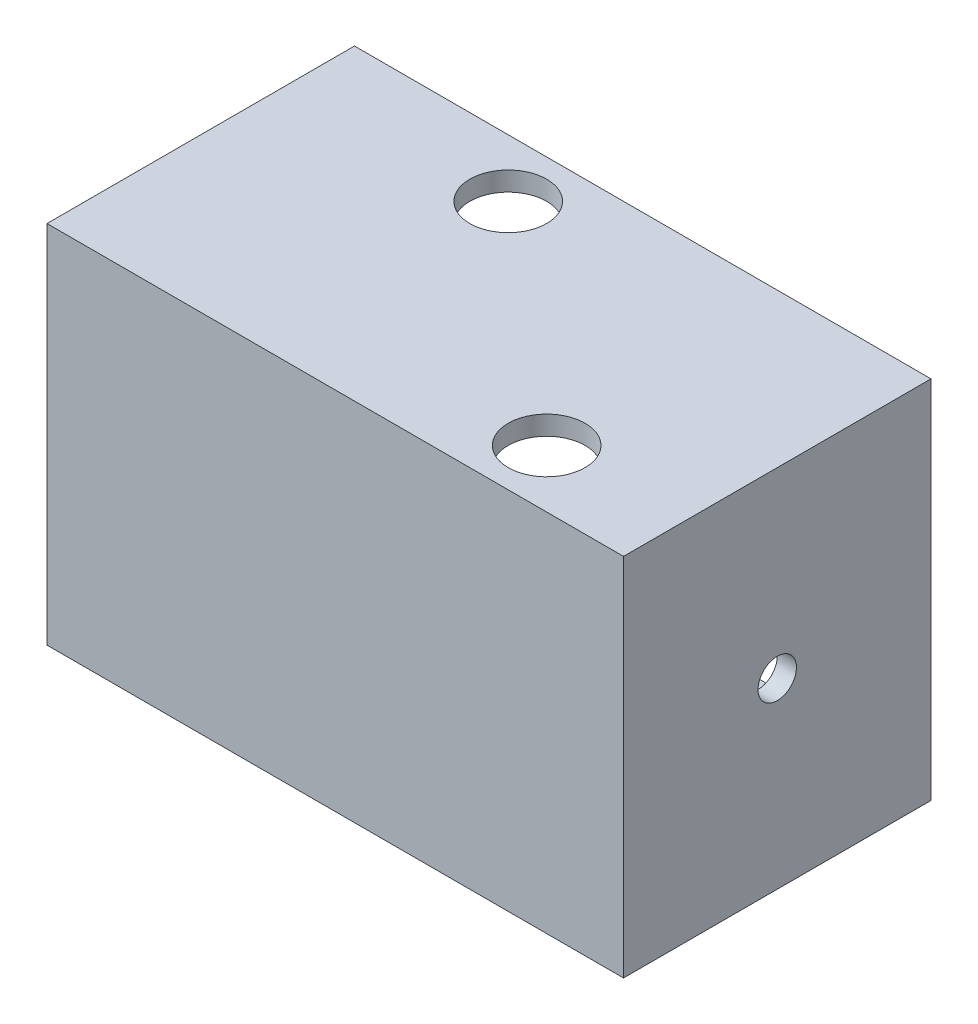
ISO-10303-21;
HEADER;
FILE_DESCRIPTION(('STEP AP214'),'2;1');
FILE_NAME('part.step','',(''),(''),'','','');
FILE_SCHEMA(('AUTOMOTIVE_DESIGN { 1 0 10303 214 1 1 1 1 }'));
ENDSEC;
DATA;
#1=APPLICATION_CONTEXT('core data for automotive mechanical design processes');
#2=APPLICATION_PROTOCOL_DEFINITION('international standard','automotive_design',2000,#1);
#3=PRODUCT_CONTEXT('',#1,'mechanical');
#4=PRODUCT('Part','Part','',(#3));
#5=PRODUCT_RELATED_PRODUCT_CATEGORY('part','',(#4));
#6=PRODUCT_DEFINITION_FORMATION('','',#4);
#7=PRODUCT_DEFINITION_CONTEXT('part definition',#1,'design');
#8=PRODUCT_DEFINITION('design','',#6,#7);
#9=PRODUCT_DEFINITION_SHAPE('','',#8);
#10=(LENGTH_UNIT() NAMED_UNIT(*) SI_UNIT(.MILLI.,.METRE.));
#11=(NAMED_UNIT(*) PLANE_ANGLE_UNIT() SI_UNIT($,.RADIAN.));
#12=(NAMED_UNIT(*) SI_UNIT($,.STERADIAN.) SOLID_ANGLE_UNIT());
#13=UNCERTAINTY_MEASURE_WITH_UNIT(LENGTH_MEASURE(1.E-05),#10,'distance_accuracy_value','');
#14=(GEOMETRIC_REPRESENTATION_CONTEXT(3) GLOBAL_UNCERTAINTY_ASSIGNED_CONTEXT((#13)) GLOBAL_UNIT_ASSIGNED_CONTEXT((#10,
#11,#12)) REPRESENTATION_CONTEXT('',''));
#15=CARTESIAN_POINT('',(0.,0.,0.));
#16=DIRECTION('',(0.,0.,1.));
#17=DIRECTION('',(1.,0.,0.));
#18=AXIS2_PLACEMENT_3D('',#15,#16,#17);
#19=CARTESIAN_POINT('',(29.,9.5,8.));
#20=DIRECTION('',(-1.,0.,0.));
#21=DIRECTION('',(0.,0.,1.));
#22=AXIS2_PLACEMENT_3D('',#19,#20,#21);
#23=CYLINDRICAL_SURFACE('',#22,3.);
#24=CARTESIAN_POINT('',(0.,9.5,8.));
#25=DIRECTION('',(-1.,0.,0.));
#26=DIRECTION('',(0.,0.,1.));
#27=AXIS2_PLACEMENT_3D('',#24,#25,#26);
#28=CIRCLE('',#27,3.);
#29=CARTESIAN_POINT('',(0.,9.5,11.));
#30=VERTEX_POINT('',#29);
#31=EDGE_CURVE('E175',#30,#30,#28,.T.);
#32=CARTESIAN_POINT('',(0.999999999999997,9.5,8.));
#33=DIRECTION('',(1.,0.,0.));
#34=DIRECTION('',(0.,1.,0.));
#35=AXIS2_PLACEMENT_3D('',#32,#33,#34);
#36=CIRCLE('',#35,3.);
#37=CARTESIAN_POINT('',(0.999999999999994,9.5,11.));
#38=VERTEX_POINT('',#37);
#39=EDGE_CURVE('E164',#38,#38,#36,.F.);
#40=CARTESIAN_POINT('',(0.,9.5,11.));
#41=CARTESIAN_POINT('',(0.0104166666666667,9.5,11.));
#42=CARTESIAN_POINT('',(0.0208333333333333,9.5,11.));
#43=CARTESIAN_POINT('',(0.0416666666666667,9.5,11.));
#44=CARTESIAN_POINT('',(0.0520833333333334,9.5,11.));
#45=CARTESIAN_POINT('',(0.0729166666666667,9.5,11.));
#46=CARTESIAN_POINT('',(0.0833333333333334,9.5,11.));
#47=CARTESIAN_POINT('',(0.104166666666667,9.5,11.));
#48=CARTESIAN_POINT('',(0.114583333333333,9.5,11.));
#49=CARTESIAN_POINT('',(0.135416666666667,9.5,11.));
#50=CARTESIAN_POINT('',(0.145833333333333,9.5,11.));
#51=CARTESIAN_POINT('',(0.166666666666667,9.5,11.));
#52=CARTESIAN_POINT('',(0.177083333333333,9.5,11.));
#53=CARTESIAN_POINT('',(0.197916666666667,9.5,11.));
#54=CARTESIAN_POINT('',(0.208333333333334,9.5,11.));
#55=CARTESIAN_POINT('',(0.229166666666667,9.5,11.));
#56=CARTESIAN_POINT('',(0.239583333333334,9.5,11.));
#57=CARTESIAN_POINT('',(0.260416666666666,9.5,11.));
#58=CARTESIAN_POINT('',(0.270833333333331,9.5,11.));
#59=CARTESIAN_POINT('',(0.291666666666663,9.5,11.));
#60=CARTESIAN_POINT('',(0.30208333333333,9.5,11.));
#61=CARTESIAN_POINT('',(0.322916666666663,9.5,11.));
#62=CARTESIAN_POINT('',(0.33333333333333,9.5,11.));
#63=CARTESIAN_POINT('',(0.354166666666664,9.5,11.));
#64=CARTESIAN_POINT('',(0.36458333333333,9.5,11.));
#65=CARTESIAN_POINT('',(0.385416666666664,9.5,11.));
#66=CARTESIAN_POINT('',(0.39583333333333,9.5,11.));
#67=CARTESIAN_POINT('',(0.416666666666664,9.5,11.));
#68=CARTESIAN_POINT('',(0.42708333333333,9.5,11.));
#69=CARTESIAN_POINT('',(0.447916666666664,9.5,11.));
#70=CARTESIAN_POINT('',(0.45833333333333,9.5,11.));
#71=CARTESIAN_POINT('',(0.479166666666664,9.5,11.));
#72=CARTESIAN_POINT('',(0.48958333333333,9.5,11.));
#73=CARTESIAN_POINT('',(0.510416666666664,9.5,11.));
#74=CARTESIAN_POINT('',(0.52083333333333,9.5,11.));
#75=CARTESIAN_POINT('',(0.541666666666664,9.5,11.));
#76=CARTESIAN_POINT('',(0.55208333333333,9.5,11.));
#77=CARTESIAN_POINT('',(0.572916666666664,9.5,11.));
#78=CARTESIAN_POINT('',(0.58333333333333,9.5,11.));
#79=CARTESIAN_POINT('',(0.604166666666664,9.5,11.));
#80=CARTESIAN_POINT('',(0.61458333333333,9.5,11.));
#81=CARTESIAN_POINT('',(0.635416666666664,9.5,11.));
#82=CARTESIAN_POINT('',(0.64583333333333,9.5,11.));
#83=CARTESIAN_POINT('',(0.666666666666664,9.5,11.));
#84=CARTESIAN_POINT('',(0.67708333333333,9.5,11.));
#85=CARTESIAN_POINT('',(0.697916666666664,9.5,11.));
#86=CARTESIAN_POINT('',(0.70833333333333,9.5,11.));
#87=CARTESIAN_POINT('',(0.729166666666663,9.5,11.));
#88=CARTESIAN_POINT('',(0.739583333333328,9.5,11.));
#89=CARTESIAN_POINT('',(0.76041666666666,9.5,11.));
#90=CARTESIAN_POINT('',(0.770833333333327,9.5,11.));
#91=CARTESIAN_POINT('',(0.79166666666666,9.5,11.));
#92=CARTESIAN_POINT('',(0.802083333333327,9.5,11.));
#93=CARTESIAN_POINT('',(0.822916666666661,9.5,11.));
#94=CARTESIAN_POINT('',(0.833333333333327,9.5,11.));
#95=CARTESIAN_POINT('',(0.854166666666661,9.5,11.));
#96=CARTESIAN_POINT('',(0.864583333333327,9.5,11.));
#97=CARTESIAN_POINT('',(0.885416666666661,9.5,11.));
#98=CARTESIAN_POINT('',(0.895833333333327,9.5,11.));
#99=CARTESIAN_POINT('',(0.916666666666661,9.5,11.));
#100=CARTESIAN_POINT('',(0.927083333333327,9.5,11.));
#101=CARTESIAN_POINT('',(0.947916666666661,9.5,11.));
#102=CARTESIAN_POINT('',(0.958333333333327,9.5,11.));
#103=CARTESIAN_POINT('',(0.979166666666661,9.5,11.));
#104=CARTESIAN_POINT('',(0.989583333333327,9.5,11.));
#105=CARTESIAN_POINT('',(0.999999999999994,9.5,11.));
#106=B_SPLINE_CURVE_WITH_KNOTS('',3,(#40,#41,#42,#43,#44,#45,#46,#47,#48,#49,#50,#51,#52,#53,
#54,#55,#56,#57,#58,#59,#60,#61,#62,#63,#64,#65,#66,#67,#68,#69,#70,#71,#72,#73,#74,#75,#76,#77,
#78,#79,#80,#81,#82,#83,#84,#85,#86,#87,#88,#89,#90,#91,#92,#93,#94,#95,#96,#97,#98,#99,#100,
#101,#102,#103,#104,#105),.UNSPECIFIED.,.F.,.F.,(4,2,2,2,2,2,2,2,2,2,2,2,2,2,2,2,2,2,2,2,2,2,2,
2,2,2,2,2,2,2,2,2,4),(0.,0.03125,0.0625000000000001,0.0937500000000001,0.125,0.15625,0.1875,
0.21875,0.25,0.281249999999997,0.312499999999997,0.343749999999997,0.374999999999997,
0.406249999999997,0.437499999999997,0.468749999999997,0.499999999999997,0.531249999999997,
0.562499999999997,0.593749999999997,0.624999999999997,0.656249999999997,0.687499999999997,
0.718749999999997,0.749999999999994,0.781249999999994,0.812499999999994,0.843749999999994,
0.874999999999994,0.906249999999994,0.937499999999994,0.968749999999994,0.999999999999994),.UNSPECIFIED.);
#107=EDGE_CURVE('BSEAM43',#30,#38,#106,.T.);
#108=ORIENTED_EDGE('',*,*,#31,.T.);
#109=ORIENTED_EDGE('',*,*,#39,.F.);
#110=ORIENTED_EDGE('',*,*,#107,.T.);
#111=ORIENTED_EDGE('',*,*,#107,.F.);
#112=EDGE_LOOP('',(#108,#110,#109,#111));
#113=FACE_BOUND('',#112,.T.);
#114=ADVANCED_FACE('F43',(#113),#23,.F.);
#115=CARTESIAN_POINT('',(0.,0.,16.));
#116=DIRECTION('',(1.,0.,0.));
#117=DIRECTION('',(0.,0.,-1.));
#118=AXIS2_PLACEMENT_3D('',#115,#116,#117);
#119=PLANE('',#118);
#120=ORIENTED_EDGE('',*,*,#31,.F.);
#121=EDGE_LOOP('',(#120));
#122=FACE_BOUND('',#121,.T.);
#123=DIRECTION('',(0.,-1.,0.));
#124=VECTOR('',#123,1.);
#125=CARTESIAN_POINT('',(0.,0.,0.));
#126=LINE('',#125,#124);
#127=CARTESIAN_POINT('',(0.,19.,0.));
#128=VERTEX_POINT('',#127);
#129=CARTESIAN_POINT('',(0.,0.,0.));
#130=VERTEX_POINT('',#129);
#131=EDGE_CURVE('E179',#128,#130,#126,.T.);
#132=ORIENTED_EDGE('',*,*,#131,.T.);
#133=DIRECTION('',(0.,0.,-1.));
#134=VECTOR('',#133,1.);
#135=CARTESIAN_POINT('',(0.,0.,16.));
#136=LINE('',#135,#134);
#137=CARTESIAN_POINT('',(0.,0.,16.));
#138=VERTEX_POINT('',#137);
#139=EDGE_CURVE('E11',#138,#130,#136,.T.);
#140=ORIENTED_EDGE('',*,*,#139,.F.);
#141=DIRECTION('',(0.,-1.,0.));
#142=VECTOR('',#141,1.);
#143=CARTESIAN_POINT('',(0.,0.,16.));
#144=LINE('',#143,#142);
#145=CARTESIAN_POINT('',(0.,19.,16.));
#146=VERTEX_POINT('',#145);
#147=EDGE_CURVE('E180',#146,#138,#144,.T.);
#148=ORIENTED_EDGE('',*,*,#147,.F.);
#149=DIRECTION('',(0.,0.,-1.));
#150=VECTOR('',#149,1.);
#151=CARTESIAN_POINT('',(0.,19.,16.));
#152=LINE('',#151,#150);
#153=EDGE_CURVE('E194',#146,#128,#152,.T.);
#154=ORIENTED_EDGE('',*,*,#153,.T.);
#155=EDGE_LOOP('',(#132,#140,#148,#154));
#156=FACE_BOUND('',#155,.T.);
#157=ADVANCED_FACE('F45',(#122,#156),#119,.F.);
#158=CARTESIAN_POINT('',(0.,0.,16.));
#159=DIRECTION('',(0.,1.,0.));
#160=DIRECTION('',(0.,0.,1.));
#161=AXIS2_PLACEMENT_3D('',#158,#159,#160);
#162=PLANE('',#161);
#163=DIRECTION('',(1.,0.,0.));
#164=VECTOR('',#163,1.);
#165=CARTESIAN_POINT('',(0.,0.,0.));
#166=LINE('',#165,#164);
#167=CARTESIAN_POINT('',(30.,0.,0.));
#168=VERTEX_POINT('',#167);
#169=EDGE_CURVE('E198',#130,#168,#166,.T.);
#170=ORIENTED_EDGE('',*,*,#169,.T.);
#171=DIRECTION('',(0.,0.,-1.));
#172=VECTOR('',#171,1.);
#173=CARTESIAN_POINT('',(30.,0.,16.));
#174=LINE('',#173,#172);
#175=CARTESIAN_POINT('',(30.,0.,16.));
#176=VERTEX_POINT('',#175);
#177=EDGE_CURVE('E53',#176,#168,#174,.T.);
#178=ORIENTED_EDGE('',*,*,#177,.F.);
#179=DIRECTION('',(1.,0.,0.));
#180=VECTOR('',#179,1.);
#181=CARTESIAN_POINT('',(0.,0.,16.));
#182=LINE('',#181,#180);
#183=EDGE_CURVE('E184',#138,#176,#182,.T.);
#184=ORIENTED_EDGE('',*,*,#183,.F.);
#185=ORIENTED_EDGE('',*,*,#139,.T.);
#186=EDGE_LOOP('',(#170,#178,#184,#185));
#187=FACE_BOUND('',#186,.T.);
#188=ADVANCED_FACE('F228',(#187),#162,.F.);
#189=CARTESIAN_POINT('',(30.,0.,16.));
#190=DIRECTION('',(-1.,0.,0.));
#191=DIRECTION('',(0.,0.,1.));
#192=AXIS2_PLACEMENT_3D('',#189,#190,#191);
#193=PLANE('',#192);
#194=CARTESIAN_POINT('',(30.,9.5,8.));
#195=DIRECTION('',(1.,0.,0.));
#196=DIRECTION('',(0.,0.,-1.));
#197=AXIS2_PLACEMENT_3D('',#194,#195,#196);
#198=CIRCLE('',#197,1.);
#199=CARTESIAN_POINT('',(30.,9.5,7.));
#200=VERTEX_POINT('',#199);
#201=EDGE_CURVE('E170',#200,#200,#198,.T.);
#202=ORIENTED_EDGE('',*,*,#201,.F.);
#203=EDGE_LOOP('',(#202));
#204=FACE_BOUND('',#203,.T.);
#205=DIRECTION('',(0.,1.,0.));
#206=VECTOR('',#205,1.);
#207=CARTESIAN_POINT('',(30.,0.,0.));
#208=LINE('',#207,#206);
#209=CARTESIAN_POINT('',(30.,19.,0.));
#210=VERTEX_POINT('',#209);
#211=EDGE_CURVE('E201',#168,#210,#208,.T.);
#212=ORIENTED_EDGE('',*,*,#211,.T.);
#213=DIRECTION('',(0.,0.,-1.));
#214=VECTOR('',#213,1.);
#215=CARTESIAN_POINT('',(30.,19.,16.));
#216=LINE('',#215,#214);
#217=CARTESIAN_POINT('',(30.,19.,16.));
#218=VERTEX_POINT('',#217);
#219=EDGE_CURVE('E209',#218,#210,#216,.T.);
#220=ORIENTED_EDGE('',*,*,#219,.F.);
#221=DIRECTION('',(0.,1.,0.));
#222=VECTOR('',#221,1.);
#223=CARTESIAN_POINT('',(30.,0.,16.));
#224=LINE('',#223,#222);
#225=EDGE_CURVE('E188',#176,#218,#224,.T.);
#226=ORIENTED_EDGE('',*,*,#225,.F.);
#227=ORIENTED_EDGE('',*,*,#177,.T.);
#228=EDGE_LOOP('',(#212,#220,#226,#227));
#229=FACE_BOUND('',#228,.T.);
#230=ADVANCED_FACE('F245',(#204,#229),#193,.F.);
#231=CARTESIAN_POINT('',(0.,19.,16.));
#232=DIRECTION('',(0.,-1.,0.));
#233=DIRECTION('',(0.,0.,-1.));
#234=AXIS2_PLACEMENT_3D('',#231,#232,#233);
#235=PLANE('',#234);
#236=CARTESIAN_POINT('',(23.,19.,13.));
#237=DIRECTION('',(0.,1.,0.));
#238=DIRECTION('',(0.,0.,1.));
#239=AXIS2_PLACEMENT_3D('',#236,#237,#238);
#240=CIRCLE('',#239,2.);
#241=CARTESIAN_POINT('',(23.,19.,15.));
#242=VERTEX_POINT('',#241);
#243=EDGE_CURVE('E411',#242,#242,#240,.T.);
#244=ORIENTED_EDGE('',*,*,#243,.F.);
#245=EDGE_LOOP('',(#244));
#246=FACE_BOUND('',#245,.T.);
#247=CARTESIAN_POINT('',(11.,19.,3.));
#248=DIRECTION('',(0.,1.,0.));
#249=DIRECTION('',(0.,0.,1.));
#250=AXIS2_PLACEMENT_3D('',#247,#248,#249);
#251=CIRCLE('',#250,2.);
#252=CARTESIAN_POINT('',(11.,19.,5.));
#253=VERTEX_POINT('',#252);
#254=EDGE_CURVE('E413',#253,#253,#251,.T.);
#255=ORIENTED_EDGE('',*,*,#254,.F.);
#256=EDGE_LOOP('',(#255));
#257=FACE_BOUND('',#256,.T.);
#258=DIRECTION('',(-1.,0.,0.));
#259=VECTOR('',#258,1.);
#260=CARTESIAN_POINT('',(0.,19.,0.));
#261=LINE('',#260,#259);
#262=EDGE_CURVE('E185',#210,#128,#261,.T.);
#263=ORIENTED_EDGE('',*,*,#262,.T.);
#264=ORIENTED_EDGE('',*,*,#153,.F.);
#265=DIRECTION('',(-1.,0.,0.));
#266=VECTOR('',#265,1.);
#267=CARTESIAN_POINT('',(0.,19.,16.));
#268=LINE('',#267,#266);
#269=EDGE_CURVE('E191',#218,#146,#268,.T.);
#270=ORIENTED_EDGE('',*,*,#269,.F.);
#271=ORIENTED_EDGE('',*,*,#219,.T.);
#272=EDGE_LOOP('',(#263,#264,#270,#271));
#273=FACE_BOUND('',#272,.T.);
#274=ADVANCED_FACE('F238',(#246,#257,#273),#235,.F.);
#275=CARTESIAN_POINT('',(0.,0.,16.));
#276=DIRECTION('',(0.,0.,-1.));
#277=DIRECTION('',(-1.,0.,0.));
#278=AXIS2_PLACEMENT_3D('',#275,#276,#277);
#279=PLANE('',#278);
#280=ORIENTED_EDGE('',*,*,#147,.T.);
#281=ORIENTED_EDGE('',*,*,#183,.T.);
#282=ORIENTED_EDGE('',*,*,#225,.T.);
#283=ORIENTED_EDGE('',*,*,#269,.T.);
#284=EDGE_LOOP('',(#280,#281,#282,#283));
#285=FACE_BOUND('',#284,.T.);
#286=ADVANCED_FACE('F234',(#285),#279,.F.);
#287=CARTESIAN_POINT('',(0.,0.,0.));
#288=DIRECTION('',(0.,0.,-1.));
#289=DIRECTION('',(-1.,0.,0.));
#290=AXIS2_PLACEMENT_3D('',#287,#288,#289);
#291=PLANE('',#290);
#292=DIRECTION('',(-1.,0.,0.));
#293=VECTOR('',#292,1.);
#294=CARTESIAN_POINT('',(29.,1.,0.));
#295=LINE('',#294,#293);
#296=CARTESIAN_POINT('',(29.,1.,0.));
#297=VERTEX_POINT('',#296);
#298=CARTESIAN_POINT('',(0.999999999999997,1.,0.));
#299=VERTEX_POINT('',#298);
#300=EDGE_CURVE('E66',#297,#299,#295,.T.);
#301=ORIENTED_EDGE('',*,*,#300,.F.);
#302=DIRECTION('',(0.,-1.,0.));
#303=VECTOR('',#302,1.);
#304=CARTESIAN_POINT('',(29.,18.,0.));
#305=LINE('',#304,#303);
#306=CARTESIAN_POINT('',(29.,18.,0.));
#307=VERTEX_POINT('',#306);
#308=EDGE_CURVE('E138',#307,#297,#305,.T.);
#309=ORIENTED_EDGE('',*,*,#308,.F.);
#310=DIRECTION('',(-1.,0.,0.));
#311=VECTOR('',#310,1.);
#312=CARTESIAN_POINT('',(29.,18.,0.));
#313=LINE('',#312,#311);
#314=CARTESIAN_POINT('',(1.,18.,0.));
#315=VERTEX_POINT('',#314);
#316=EDGE_CURVE('E142',#307,#315,#313,.T.);
#317=ORIENTED_EDGE('',*,*,#316,.T.);
#318=DIRECTION('',(0.,-1.,0.));
#319=VECTOR('',#318,1.);
#320=CARTESIAN_POINT('',(1.,18.,0.));
#321=LINE('',#320,#319);
#322=EDGE_CURVE('E155',#315,#299,#321,.T.);
#323=ORIENTED_EDGE('',*,*,#322,.T.);
#324=EDGE_LOOP('',(#301,#309,#317,#323));
#325=FACE_BOUND('',#324,.T.);
#326=ORIENTED_EDGE('',*,*,#131,.F.);
#327=ORIENTED_EDGE('',*,*,#262,.F.);
#328=ORIENTED_EDGE('',*,*,#211,.F.);
#329=ORIENTED_EDGE('',*,*,#169,.F.);
#330=EDGE_LOOP('',(#326,#327,#328,#329));
#331=FACE_BOUND('',#330,.T.);
#332=ADVANCED_FACE('F237',(#325,#331),#291,.T.);
#333=CARTESIAN_POINT('',(29.,9.5,8.));
#334=DIRECTION('',(-1.,0.,0.));
#335=DIRECTION('',(0.,0.,1.));
#336=AXIS2_PLACEMENT_3D('',#333,#334,#335);
#337=PLANE('',#336);
#338=CARTESIAN_POINT('',(29.,9.5,8.));
#339=DIRECTION('',(-1.,0.,0.));
#340=DIRECTION('',(0.,0.,1.));
#341=AXIS2_PLACEMENT_3D('',#338,#339,#340);
#342=CIRCLE('',#341,1.);
#343=CARTESIAN_POINT('',(29.,9.5,9.));
#344=VERTEX_POINT('',#343);
#345=EDGE_CURVE('E174',#344,#344,#342,.T.);
#346=ORIENTED_EDGE('',*,*,#345,.F.);
#347=EDGE_LOOP('',(#346));
#348=FACE_BOUND('',#347,.T.);
#349=ORIENTED_EDGE('',*,*,#308,.T.);
#350=DIRECTION('',(0.,0.,-1.));
#351=VECTOR('',#350,1.);
#352=CARTESIAN_POINT('',(29.,1.,15.));
#353=LINE('',#352,#351);
#354=CARTESIAN_POINT('',(29.,1.,15.));
#355=VERTEX_POINT('',#354);
#356=EDGE_CURVE('E161',#355,#297,#353,.T.);
#357=ORIENTED_EDGE('',*,*,#356,.F.);
#358=DIRECTION('',(0.,-1.,0.));
#359=VECTOR('',#358,1.);
#360=CARTESIAN_POINT('',(29.,18.,15.));
#361=LINE('',#360,#359);
#362=CARTESIAN_POINT('',(29.,18.,15.));
#363=VERTEX_POINT('',#362);
#364=EDGE_CURVE('E132',#363,#355,#361,.T.);
#365=ORIENTED_EDGE('',*,*,#364,.F.);
#366=DIRECTION('',(0.,0.,-1.));
#367=VECTOR('',#366,1.);
#368=CARTESIAN_POINT('',(29.,18.,15.));
#369=LINE('',#368,#367);
#370=EDGE_CURVE('E165',#363,#307,#369,.T.);
#371=ORIENTED_EDGE('',*,*,#370,.T.);
#372=EDGE_LOOP('',(#349,#357,#365,#371));
#373=FACE_BOUND('',#372,.T.);
#374=ADVANCED_FACE('F232',(#348,#373),#337,.T.);
#375=CARTESIAN_POINT('',(22.,9.5,8.));
#376=DIRECTION('',(1.,0.,0.));
#377=DIRECTION('',(0.,0.,-1.));
#378=AXIS2_PLACEMENT_3D('',#375,#376,#377);
#379=CYLINDRICAL_SURFACE('',#378,1.);
#380=ORIENTED_EDGE('',*,*,#345,.T.);
#381=EDGE_LOOP('',(#380));
#382=FACE_BOUND('',#381,.T.);
#383=ORIENTED_EDGE('',*,*,#201,.T.);
#384=EDGE_LOOP('',(#383));
#385=FACE_BOUND('',#384,.T.);
#386=ADVANCED_FACE('F294',(#382,#385),#379,.F.);
#387=CARTESIAN_POINT('',(1.,18.,15.));
#388=DIRECTION('',(1.,0.,0.));
#389=DIRECTION('',(0.,1.,0.));
#390=AXIS2_PLACEMENT_3D('',#387,#388,#389);
#391=PLANE('',#390);
#392=ORIENTED_EDGE('',*,*,#322,.F.);
#393=DIRECTION('',(0.,0.,-1.));
#394=VECTOR('',#393,1.);
#395=CARTESIAN_POINT('',(1.,18.,15.));
#396=LINE('',#395,#394);
#397=CARTESIAN_POINT('',(1.,18.,15.));
#398=VERTEX_POINT('',#397);
#399=EDGE_CURVE('E120',#398,#315,#396,.T.);
#400=ORIENTED_EDGE('',*,*,#399,.F.);
#401=DIRECTION('',(0.,-1.,0.));
#402=VECTOR('',#401,1.);
#403=CARTESIAN_POINT('',(1.,18.,15.));
#404=LINE('',#403,#402);
#405=CARTESIAN_POINT('',(0.999999999999997,1.,15.));
#406=VERTEX_POINT('',#405);
#407=EDGE_CURVE('E114',#398,#406,#404,.T.);
#408=ORIENTED_EDGE('',*,*,#407,.T.);
#409=DIRECTION('',(0.,0.,-1.));
#410=VECTOR('',#409,1.);
#411=CARTESIAN_POINT('',(0.999999999999997,1.,15.));
#412=LINE('',#411,#410);
#413=EDGE_CURVE('E118',#406,#299,#412,.T.);
#414=ORIENTED_EDGE('',*,*,#413,.T.);
#415=EDGE_LOOP('',(#392,#400,#408,#414));
#416=FACE_BOUND('',#415,.T.);
#417=ORIENTED_EDGE('',*,*,#39,.T.);
#418=EDGE_LOOP('',(#417));
#419=FACE_BOUND('',#418,.T.);
#420=ADVANCED_FACE('F116',(#416,#419),#391,.T.);
#421=CARTESIAN_POINT('',(29.,1.,15.));
#422=DIRECTION('',(0.,-1.,0.));
#423=DIRECTION('',(0.,0.,-1.));
#424=AXIS2_PLACEMENT_3D('',#421,#422,#423);
#425=PLANE('',#424);
#426=ORIENTED_EDGE('',*,*,#300,.T.);
#427=ORIENTED_EDGE('',*,*,#413,.F.);
#428=DIRECTION('',(-1.,0.,0.));
#429=VECTOR('',#428,1.);
#430=CARTESIAN_POINT('',(29.,1.,15.));
#431=LINE('',#430,#429);
#432=EDGE_CURVE('E126',#355,#406,#431,.T.);
#433=ORIENTED_EDGE('',*,*,#432,.F.);
#434=ORIENTED_EDGE('',*,*,#356,.T.);
#435=EDGE_LOOP('',(#426,#427,#433,#434));
#436=FACE_BOUND('',#435,.T.);
#437=ADVANCED_FACE('F129',(#436),#425,.F.);
#438=CARTESIAN_POINT('',(29.,18.,15.));
#439=DIRECTION('',(0.,-1.,0.));
#440=DIRECTION('',(0.,0.,-1.));
#441=AXIS2_PLACEMENT_3D('',#438,#439,#440);
#442=PLANE('',#441);
#443=CARTESIAN_POINT('',(11.,18.,3.));
#444=DIRECTION('',(0.,-1.,0.));
#445=DIRECTION('',(0.,0.,-1.));
#446=AXIS2_PLACEMENT_3D('',#443,#444,#445);
#447=CIRCLE('',#446,2.);
#448=CARTESIAN_POINT('',(11.,18.,1.));
#449=VERTEX_POINT('',#448);
#450=EDGE_CURVE('E47',#449,#449,#447,.T.);
#451=ORIENTED_EDGE('',*,*,#450,.F.);
#452=EDGE_LOOP('',(#451));
#453=FACE_BOUND('',#452,.T.);
#454=DIRECTION('',(-1.,0.,0.));
#455=VECTOR('',#454,1.);
#456=CARTESIAN_POINT('',(29.,18.,15.));
#457=LINE('',#456,#455);
#458=CARTESIAN_POINT('',(23.,18.,15.));
#459=VERTEX_POINT('',#458);
#460=EDGE_CURVE('E147',#363,#459,#457,.T.);
#461=ORIENTED_EDGE('',*,*,#460,.T.);
#462=CARTESIAN_POINT('',(23.,18.,13.));
#463=DIRECTION('',(0.,-1.,0.));
#464=DIRECTION('',(0.,0.,-1.));
#465=AXIS2_PLACEMENT_3D('',#462,#463,#464);
#466=CIRCLE('',#465,2.);
#467=EDGE_CURVE('E59',#459,#459,#466,.T.);
#468=ORIENTED_EDGE('',*,*,#467,.F.);
#469=EDGE_CURVE('E125',#459,#398,#457,.T.);
#470=ORIENTED_EDGE('',*,*,#469,.T.);
#471=ORIENTED_EDGE('',*,*,#399,.T.);
#472=ORIENTED_EDGE('',*,*,#316,.F.);
#473=ORIENTED_EDGE('',*,*,#370,.F.);
#474=EDGE_LOOP('',(#461,#468,#470,#471,#472,#473));
#475=FACE_BOUND('',#474,.T.);
#476=ADVANCED_FACE('F311',(#453,#475),#442,.T.);
#477=CARTESIAN_POINT('',(0.,0.,15.));
#478=DIRECTION('',(0.,0.,1.));
#479=DIRECTION('',(1.,0.,0.));
#480=AXIS2_PLACEMENT_3D('',#477,#478,#479);
#481=PLANE('',#480);
#482=ORIENTED_EDGE('',*,*,#469,.F.);
#483=ORIENTED_EDGE('',*,*,#460,.F.);
#484=ORIENTED_EDGE('',*,*,#364,.T.);
#485=ORIENTED_EDGE('',*,*,#432,.T.);
#486=ORIENTED_EDGE('',*,*,#407,.F.);
#487=EDGE_LOOP('',(#482,#483,#484,#485,#486));
#488=FACE_BOUND('',#487,.T.);
#489=ADVANCED_FACE('F134',(#488),#481,.F.);
#490=CARTESIAN_POINT('',(11.,17.5,3.));
#491=DIRECTION('',(0.,1.,0.));
#492=DIRECTION('',(0.,0.,1.));
#493=AXIS2_PLACEMENT_3D('',#490,#491,#492);
#494=CYLINDRICAL_SURFACE('',#493,2.);
#495=ORIENTED_EDGE('',*,*,#450,.T.);
#496=EDGE_LOOP('',(#495));
#497=FACE_BOUND('',#496,.T.);
#498=ORIENTED_EDGE('',*,*,#254,.T.);
#499=EDGE_LOOP('',(#498));
#500=FACE_BOUND('',#499,.T.);
#501=ADVANCED_FACE('F324',(#497,#500),#494,.F.);
#502=CARTESIAN_POINT('',(23.,17.5,13.));
#503=DIRECTION('',(0.,1.,0.));
#504=DIRECTION('',(0.,0.,1.));
#505=AXIS2_PLACEMENT_3D('',#502,#503,#504);
#506=CYLINDRICAL_SURFACE('',#505,2.);
#507=ORIENTED_EDGE('',*,*,#467,.T.);
#508=EDGE_LOOP('',(#507));
#509=FACE_BOUND('',#508,.T.);
#510=ORIENTED_EDGE('',*,*,#243,.T.);
#511=EDGE_LOOP('',(#510));
#512=FACE_BOUND('',#511,.T.);
#513=ADVANCED_FACE('F331',(#509,#512),#506,.F.);
#514=CLOSED_SHELL('',(#114,#157,#188,#230,#274,#286,#332,#374,#386,#420,#437,#476,#489,#501,#513));
#515=MANIFOLD_SOLID_BREP('B2',#514);
#516=ADVANCED_BREP_SHAPE_REPRESENTATION('',(#18,#515),#14);
#517=SHAPE_DEFINITION_REPRESENTATION(#9,#516);
ENDSEC;
END-ISO-10303-21;
